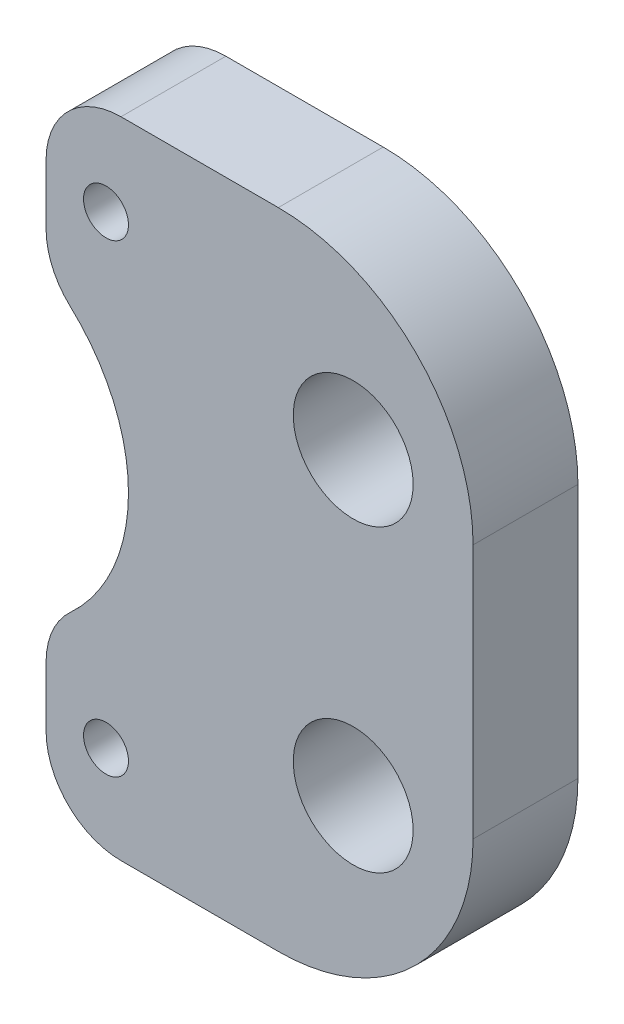
ISO-10303-21;
HEADER;
FILE_DESCRIPTION(('STEP AP214'),'2;1');
FILE_NAME('part.step','',(''),(''),'','','');
FILE_SCHEMA(('AUTOMOTIVE_DESIGN { 1 0 10303 214 1 1 1 1 }'));
ENDSEC;
DATA;
#1=APPLICATION_CONTEXT('core data for automotive mechanical design processes');
#2=APPLICATION_PROTOCOL_DEFINITION('international standard','automotive_design',2000,#1);
#3=PRODUCT_CONTEXT('',#1,'mechanical');
#4=PRODUCT('Part','Part','',(#3));
#5=PRODUCT_RELATED_PRODUCT_CATEGORY('part','',(#4));
#6=PRODUCT_DEFINITION_FORMATION('','',#4);
#7=PRODUCT_DEFINITION_CONTEXT('part definition',#1,'design');
#8=PRODUCT_DEFINITION('design','',#6,#7);
#9=PRODUCT_DEFINITION_SHAPE('','',#8);
#10=(LENGTH_UNIT() NAMED_UNIT(*) SI_UNIT(.MILLI.,.METRE.));
#11=(NAMED_UNIT(*) PLANE_ANGLE_UNIT() SI_UNIT($,.RADIAN.));
#12=(NAMED_UNIT(*) SI_UNIT($,.STERADIAN.) SOLID_ANGLE_UNIT());
#13=UNCERTAINTY_MEASURE_WITH_UNIT(LENGTH_MEASURE(1.E-05),#10,'distance_accuracy_value','');
#14=(GEOMETRIC_REPRESENTATION_CONTEXT(3) GLOBAL_UNCERTAINTY_ASSIGNED_CONTEXT((#13)) GLOBAL_UNIT_ASSIGNED_CONTEXT((#10,
#11,#12)) REPRESENTATION_CONTEXT('',''));
#15=CARTESIAN_POINT('',(0.,0.,0.));
#16=DIRECTION('',(0.,0.,1.));
#17=DIRECTION('',(1.,0.,0.));
#18=AXIS2_PLACEMENT_3D('',#15,#16,#17);
#19=CARTESIAN_POINT('',(5.,34.0199840255489,7.));
#20=DIRECTION('',(0.,0.,-1.));
#21=DIRECTION('',(-1.,0.,0.));
#22=AXIS2_PLACEMENT_3D('',#19,#20,#21);
#23=PLANE('',#22);
#24=CARTESIAN_POINT('',(4.,37.,7.));
#25=DIRECTION('',(0.,0.,1.));
#26=DIRECTION('',(1.,0.,0.));
#27=AXIS2_PLACEMENT_3D('',#24,#25,#26);
#28=CIRCLE('',#27,1.5);
#29=CARTESIAN_POINT('',(5.5,37.,7.));
#30=VERTEX_POINT('',#29);
#31=EDGE_CURVE('E292',#30,#30,#28,.T.);
#32=ORIENTED_EDGE('',*,*,#31,.F.);
#33=EDGE_LOOP('',(#32));
#34=FACE_BOUND('',#33,.T.);
#35=CARTESIAN_POINT('',(20.5,31.5,7.));
#36=DIRECTION('',(0.,0.,1.));
#37=DIRECTION('',(1.,0.,0.));
#38=AXIS2_PLACEMENT_3D('',#35,#36,#37);
#39=CIRCLE('',#38,4.00000000000002);
#40=CARTESIAN_POINT('',(24.5,31.5,7.));
#41=VERTEX_POINT('',#40);
#42=EDGE_CURVE('E158',#41,#41,#39,.T.);
#43=ORIENTED_EDGE('',*,*,#42,.F.);
#44=EDGE_LOOP('',(#43));
#45=FACE_BOUND('',#44,.T.);
#46=CARTESIAN_POINT('',(5.,34.0199840255489,7.));
#47=DIRECTION('',(0.,0.,1.));
#48=DIRECTION('',(-1.,0.,0.));
#49=AXIS2_PLACEMENT_3D('',#46,#47,#48);
#50=CIRCLE('',#49,5.);
#51=CARTESIAN_POINT('',(0.,34.0199840255489,7.));
#52=VERTEX_POINT('',#51);
#53=CARTESIAN_POINT('',(1.61764705882352,30.3376357827404,7.));
#54=VERTEX_POINT('',#53);
#55=EDGE_CURVE('E177',#52,#54,#50,.T.);
#56=ORIENTED_EDGE('',*,*,#55,.T.);
#57=CARTESIAN_POINT('',(-6.50000000000001,21.5,7.));
#58=DIRECTION('',(0.,0.,-1.));
#59=DIRECTION('',(1.,0.,0.));
#60=AXIS2_PLACEMENT_3D('',#57,#58,#59);
#61=CIRCLE('',#60,12.);
#62=CARTESIAN_POINT('',(1.61764705882352,12.6623642172596,7.));
#63=VERTEX_POINT('',#62);
#64=EDGE_CURVE('E105',#54,#63,#61,.T.);
#65=ORIENTED_EDGE('',*,*,#64,.T.);
#66=CARTESIAN_POINT('',(5.,8.9800159744511,7.));
#67=DIRECTION('',(0.,0.,1.));
#68=DIRECTION('',(-1.,0.,0.));
#69=AXIS2_PLACEMENT_3D('',#66,#67,#68);
#70=CIRCLE('',#69,5.);
#71=CARTESIAN_POINT('',(0.,8.9800159744511,7.));
#72=VERTEX_POINT('',#71);
#73=EDGE_CURVE('E204',#63,#72,#70,.T.);
#74=ORIENTED_EDGE('',*,*,#73,.T.);
#75=DIRECTION('',(0.,-1.,0.));
#76=VECTOR('',#75,1.);
#77=CARTESIAN_POINT('',(0.,5.00000000000004,7.));
#78=LINE('',#77,#76);
#79=CARTESIAN_POINT('',(0.,5.00000000000004,7.));
#80=VERTEX_POINT('',#79);
#81=EDGE_CURVE('E223',#72,#80,#78,.T.);
#82=ORIENTED_EDGE('',*,*,#81,.T.);
#83=CARTESIAN_POINT('',(5.,5.,7.));
#84=DIRECTION('',(0.,0.,1.));
#85=DIRECTION('',(1.,0.,0.));
#86=AXIS2_PLACEMENT_3D('',#83,#84,#85);
#87=CIRCLE('',#86,5.);
#88=CARTESIAN_POINT('',(5.00000000000003,0.,7.));
#89=VERTEX_POINT('',#88);
#90=EDGE_CURVE('E220',#80,#89,#87,.T.);
#91=ORIENTED_EDGE('',*,*,#90,.T.);
#92=DIRECTION('',(1.,0.,0.));
#93=VECTOR('',#92,1.);
#94=CARTESIAN_POINT('',(5.00000000000004,0.,7.));
#95=LINE('',#94,#93);
#96=CARTESIAN_POINT('',(15.5,0.,7.));
#97=VERTEX_POINT('',#96);
#98=EDGE_CURVE('E222',#89,#97,#95,.T.);
#99=ORIENTED_EDGE('',*,*,#98,.T.);
#100=CARTESIAN_POINT('',(15.5,13.,7.));
#101=DIRECTION('',(0.,0.,1.));
#102=DIRECTION('',(-1.,0.,0.));
#103=AXIS2_PLACEMENT_3D('',#100,#101,#102);
#104=CIRCLE('',#103,13.);
#105=CARTESIAN_POINT('',(28.5,13.,7.));
#106=VERTEX_POINT('',#105);
#107=EDGE_CURVE('E225',#97,#106,#104,.T.);
#108=ORIENTED_EDGE('',*,*,#107,.T.);
#109=DIRECTION('',(0.,1.,0.));
#110=VECTOR('',#109,1.);
#111=CARTESIAN_POINT('',(28.5,13.,7.));
#112=LINE('',#111,#110);
#113=CARTESIAN_POINT('',(28.5,30.,7.));
#114=VERTEX_POINT('',#113);
#115=EDGE_CURVE('E231',#106,#114,#112,.T.);
#116=ORIENTED_EDGE('',*,*,#115,.T.);
#117=CARTESIAN_POINT('',(15.5,30.,7.));
#118=DIRECTION('',(0.,0.,1.));
#119=DIRECTION('',(1.,0.,0.));
#120=AXIS2_PLACEMENT_3D('',#117,#118,#119);
#121=CIRCLE('',#120,13.);
#122=CARTESIAN_POINT('',(15.5,43.,7.));
#123=VERTEX_POINT('',#122);
#124=EDGE_CURVE('E136',#114,#123,#121,.T.);
#125=ORIENTED_EDGE('',*,*,#124,.T.);
#126=DIRECTION('',(-1.,0.,0.));
#127=VECTOR('',#126,1.);
#128=CARTESIAN_POINT('',(15.5,43.,7.));
#129=LINE('',#128,#127);
#130=CARTESIAN_POINT('',(5.00000000000004,43.,7.));
#131=VERTEX_POINT('',#130);
#132=EDGE_CURVE('E130',#123,#131,#129,.T.);
#133=ORIENTED_EDGE('',*,*,#132,.T.);
#134=CARTESIAN_POINT('',(5.,38.,7.));
#135=DIRECTION('',(0.,0.,1.));
#136=DIRECTION('',(1.,0.,0.));
#137=AXIS2_PLACEMENT_3D('',#134,#135,#136);
#138=CIRCLE('',#137,5.);
#139=CARTESIAN_POINT('',(0.,38.,7.));
#140=VERTEX_POINT('',#139);
#141=EDGE_CURVE('E134',#131,#140,#138,.T.);
#142=ORIENTED_EDGE('',*,*,#141,.T.);
#143=DIRECTION('',(0.,-1.,0.));
#144=VECTOR('',#143,1.);
#145=CARTESIAN_POINT('',(0.,34.0199840255489,7.));
#146=LINE('',#145,#144);
#147=EDGE_CURVE('E50',#140,#52,#146,.T.);
#148=ORIENTED_EDGE('',*,*,#147,.T.);
#149=EDGE_LOOP('',(#56,#65,#74,#82,#91,#99,#108,#116,#125,#133,#142,#148));
#150=FACE_BOUND('',#149,.T.);
#151=CARTESIAN_POINT('',(20.5,11.5,7.));
#152=DIRECTION('',(0.,0.,1.));
#153=DIRECTION('',(1.,0.,0.));
#154=AXIS2_PLACEMENT_3D('',#151,#152,#153);
#155=CIRCLE('',#154,4.00000000000001);
#156=CARTESIAN_POINT('',(24.5,11.5,7.));
#157=VERTEX_POINT('',#156);
#158=EDGE_CURVE('E298',#157,#157,#155,.T.);
#159=ORIENTED_EDGE('',*,*,#158,.F.);
#160=EDGE_LOOP('',(#159));
#161=FACE_BOUND('',#160,.T.);
#162=CARTESIAN_POINT('',(4.,6.,7.));
#163=DIRECTION('',(0.,0.,1.));
#164=DIRECTION('',(1.,0.,0.));
#165=AXIS2_PLACEMENT_3D('',#162,#163,#164);
#166=CIRCLE('',#165,1.5);
#167=CARTESIAN_POINT('',(5.5,6.,7.));
#168=VERTEX_POINT('',#167);
#169=EDGE_CURVE('E283',#168,#168,#166,.T.);
#170=ORIENTED_EDGE('',*,*,#169,.F.);
#171=EDGE_LOOP('',(#170));
#172=FACE_BOUND('',#171,.T.);
#173=ADVANCED_FACE('F33',(#34,#45,#150,#161,#172),#23,.F.);
#174=CARTESIAN_POINT('',(5.,34.0199840255489,0.));
#175=DIRECTION('',(0.,0.,-1.));
#176=DIRECTION('',(-1.,0.,0.));
#177=AXIS2_PLACEMENT_3D('',#174,#175,#176);
#178=PLANE('',#177);
#179=CARTESIAN_POINT('',(4.,37.,0.));
#180=DIRECTION('',(0.,0.,1.));
#181=DIRECTION('',(1.,0.,0.));
#182=AXIS2_PLACEMENT_3D('',#179,#180,#181);
#183=CIRCLE('',#182,1.5);
#184=CARTESIAN_POINT('',(5.5,37.,0.));
#185=VERTEX_POINT('',#184);
#186=EDGE_CURVE('E289',#185,#185,#183,.T.);
#187=ORIENTED_EDGE('',*,*,#186,.T.);
#188=EDGE_LOOP('',(#187));
#189=FACE_BOUND('',#188,.T.);
#190=CARTESIAN_POINT('',(20.5,31.5,0.));
#191=DIRECTION('',(0.,0.,1.));
#192=DIRECTION('',(1.,0.,0.));
#193=AXIS2_PLACEMENT_3D('',#190,#191,#192);
#194=CIRCLE('',#193,4.00000000000002);
#195=CARTESIAN_POINT('',(24.5,31.5,0.));
#196=VERTEX_POINT('',#195);
#197=EDGE_CURVE('E301',#196,#196,#194,.T.);
#198=ORIENTED_EDGE('',*,*,#197,.T.);
#199=EDGE_LOOP('',(#198));
#200=FACE_BOUND('',#199,.T.);
#201=CARTESIAN_POINT('',(5.,34.0199840255489,0.));
#202=DIRECTION('',(0.,0.,1.));
#203=DIRECTION('',(-1.,0.,0.));
#204=AXIS2_PLACEMENT_3D('',#201,#202,#203);
#205=CIRCLE('',#204,5.);
#206=CARTESIAN_POINT('',(0.,34.0199840255489,0.));
#207=VERTEX_POINT('',#206);
#208=CARTESIAN_POINT('',(1.61764705882352,30.3376357827404,0.));
#209=VERTEX_POINT('',#208);
#210=EDGE_CURVE('E154',#207,#209,#205,.T.);
#211=ORIENTED_EDGE('',*,*,#210,.F.);
#212=DIRECTION('',(0.,-1.,0.));
#213=VECTOR('',#212,1.);
#214=CARTESIAN_POINT('',(0.,34.0199840255489,0.));
#215=LINE('',#214,#213);
#216=CARTESIAN_POINT('',(0.,38.,0.));
#217=VERTEX_POINT('',#216);
#218=EDGE_CURVE('E97',#217,#207,#215,.T.);
#219=ORIENTED_EDGE('',*,*,#218,.F.);
#220=CARTESIAN_POINT('',(5.,38.,0.));
#221=DIRECTION('',(0.,0.,1.));
#222=DIRECTION('',(1.,0.,0.));
#223=AXIS2_PLACEMENT_3D('',#220,#221,#222);
#224=CIRCLE('',#223,5.);
#225=CARTESIAN_POINT('',(5.00000000000004,43.,0.));
#226=VERTEX_POINT('',#225);
#227=EDGE_CURVE('E91',#226,#217,#224,.T.);
#228=ORIENTED_EDGE('',*,*,#227,.F.);
#229=DIRECTION('',(-1.,0.,0.));
#230=VECTOR('',#229,1.);
#231=CARTESIAN_POINT('',(15.5,43.,0.));
#232=LINE('',#231,#230);
#233=CARTESIAN_POINT('',(15.5,43.,0.));
#234=VERTEX_POINT('',#233);
#235=EDGE_CURVE('E144',#234,#226,#232,.T.);
#236=ORIENTED_EDGE('',*,*,#235,.F.);
#237=CARTESIAN_POINT('',(15.5,30.,0.));
#238=DIRECTION('',(0.,0.,1.));
#239=DIRECTION('',(1.,0.,0.));
#240=AXIS2_PLACEMENT_3D('',#237,#238,#239);
#241=CIRCLE('',#240,13.);
#242=CARTESIAN_POINT('',(28.5,30.,0.));
#243=VERTEX_POINT('',#242);
#244=EDGE_CURVE('E172',#243,#234,#241,.T.);
#245=ORIENTED_EDGE('',*,*,#244,.F.);
#246=DIRECTION('',(0.,1.,0.));
#247=VECTOR('',#246,1.);
#248=CARTESIAN_POINT('',(28.5,13.,0.));
#249=LINE('',#248,#247);
#250=CARTESIAN_POINT('',(28.5,13.,0.));
#251=VERTEX_POINT('',#250);
#252=EDGE_CURVE('E170',#251,#243,#249,.T.);
#253=ORIENTED_EDGE('',*,*,#252,.F.);
#254=CARTESIAN_POINT('',(15.5,13.,0.));
#255=DIRECTION('',(0.,0.,1.));
#256=DIRECTION('',(-1.,0.,0.));
#257=AXIS2_PLACEMENT_3D('',#254,#255,#256);
#258=CIRCLE('',#257,13.);
#259=CARTESIAN_POINT('',(15.5,0.,0.));
#260=VERTEX_POINT('',#259);
#261=EDGE_CURVE('E168',#260,#251,#258,.T.);
#262=ORIENTED_EDGE('',*,*,#261,.F.);
#263=DIRECTION('',(1.,0.,0.));
#264=VECTOR('',#263,1.);
#265=CARTESIAN_POINT('',(5.00000000000004,0.,0.));
#266=LINE('',#265,#264);
#267=CARTESIAN_POINT('',(5.00000000000003,0.,0.));
#268=VERTEX_POINT('',#267);
#269=EDGE_CURVE('E166',#268,#260,#266,.T.);
#270=ORIENTED_EDGE('',*,*,#269,.F.);
#271=CARTESIAN_POINT('',(5.,5.,0.));
#272=DIRECTION('',(0.,0.,1.));
#273=DIRECTION('',(1.,0.,0.));
#274=AXIS2_PLACEMENT_3D('',#271,#272,#273);
#275=CIRCLE('',#274,5.);
#276=CARTESIAN_POINT('',(0.,5.00000000000004,0.));
#277=VERTEX_POINT('',#276);
#278=EDGE_CURVE('E164',#277,#268,#275,.T.);
#279=ORIENTED_EDGE('',*,*,#278,.F.);
#280=DIRECTION('',(0.,-1.,0.));
#281=VECTOR('',#280,1.);
#282=CARTESIAN_POINT('',(0.,5.00000000000004,0.));
#283=LINE('',#282,#281);
#284=CARTESIAN_POINT('',(0.,8.9800159744511,0.));
#285=VERTEX_POINT('',#284);
#286=EDGE_CURVE('E162',#285,#277,#283,.T.);
#287=ORIENTED_EDGE('',*,*,#286,.F.);
#288=CARTESIAN_POINT('',(5.,8.9800159744511,0.));
#289=DIRECTION('',(0.,0.,1.));
#290=DIRECTION('',(-1.,0.,0.));
#291=AXIS2_PLACEMENT_3D('',#288,#289,#290);
#292=CIRCLE('',#291,5.);
#293=CARTESIAN_POINT('',(1.61764705882352,12.6623642172596,0.));
#294=VERTEX_POINT('',#293);
#295=EDGE_CURVE('E160',#294,#285,#292,.T.);
#296=ORIENTED_EDGE('',*,*,#295,.F.);
#297=CARTESIAN_POINT('',(-6.50000000000001,21.5,0.));
#298=DIRECTION('',(0.,0.,-1.));
#299=DIRECTION('',(1.,0.,0.));
#300=AXIS2_PLACEMENT_3D('',#297,#298,#299);
#301=CIRCLE('',#300,12.);
#302=EDGE_CURVE('E157',#209,#294,#301,.T.);
#303=ORIENTED_EDGE('',*,*,#302,.F.);
#304=EDGE_LOOP('',(#211,#219,#228,#236,#245,#253,#262,#270,#279,#287,#296,#303));
#305=FACE_BOUND('',#304,.T.);
#306=CARTESIAN_POINT('',(20.5,11.5,0.));
#307=DIRECTION('',(0.,0.,1.));
#308=DIRECTION('',(1.,0.,0.));
#309=AXIS2_PLACEMENT_3D('',#306,#307,#308);
#310=CIRCLE('',#309,4.00000000000001);
#311=CARTESIAN_POINT('',(24.5,11.5,0.));
#312=VERTEX_POINT('',#311);
#313=EDGE_CURVE('E295',#312,#312,#310,.T.);
#314=ORIENTED_EDGE('',*,*,#313,.T.);
#315=EDGE_LOOP('',(#314));
#316=FACE_BOUND('',#315,.T.);
#317=CARTESIAN_POINT('',(4.,6.,0.));
#318=DIRECTION('',(0.,0.,1.));
#319=DIRECTION('',(1.,0.,0.));
#320=AXIS2_PLACEMENT_3D('',#317,#318,#319);
#321=CIRCLE('',#320,1.5);
#322=CARTESIAN_POINT('',(5.5,6.,0.));
#323=VERTEX_POINT('',#322);
#324=EDGE_CURVE('E286',#323,#323,#321,.T.);
#325=ORIENTED_EDGE('',*,*,#324,.T.);
#326=EDGE_LOOP('',(#325));
#327=FACE_BOUND('',#326,.T.);
#328=ADVANCED_FACE('F208',(#189,#200,#305,#316,#327),#178,.T.);
#329=CARTESIAN_POINT('',(5.,34.0199840255489,7.));
#330=DIRECTION('',(0.,0.,-1.));
#331=DIRECTION('',(-1.,0.,0.));
#332=AXIS2_PLACEMENT_3D('',#329,#330,#331);
#333=CYLINDRICAL_SURFACE('',#332,5.);
#334=ORIENTED_EDGE('',*,*,#210,.T.);
#335=DIRECTION('',(0.,0.,-1.));
#336=VECTOR('',#335,1.);
#337=CARTESIAN_POINT('',(1.61764705882352,30.3376357827404,7.));
#338=LINE('',#337,#336);
#339=EDGE_CURVE('E11',#54,#209,#338,.T.);
#340=ORIENTED_EDGE('',*,*,#339,.F.);
#341=ORIENTED_EDGE('',*,*,#55,.F.);
#342=DIRECTION('',(0.,0.,-1.));
#343=VECTOR('',#342,1.);
#344=CARTESIAN_POINT('',(0.,34.0199840255489,7.));
#345=LINE('',#344,#343);
#346=EDGE_CURVE('E150',#52,#207,#345,.T.);
#347=ORIENTED_EDGE('',*,*,#346,.T.);
#348=EDGE_LOOP('',(#334,#340,#341,#347));
#349=FACE_BOUND('',#348,.T.);
#350=ADVANCED_FACE('F35',(#349),#333,.T.);
#351=CARTESIAN_POINT('',(-6.50000000000001,21.5,7.));
#352=DIRECTION('',(0.,0.,-1.));
#353=DIRECTION('',(-1.,0.,0.));
#354=AXIS2_PLACEMENT_3D('',#351,#352,#353);
#355=CYLINDRICAL_SURFACE('',#354,12.);
#356=ORIENTED_EDGE('',*,*,#302,.T.);
#357=DIRECTION('',(0.,0.,-1.));
#358=VECTOR('',#357,1.);
#359=CARTESIAN_POINT('',(1.61764705882352,12.6623642172596,7.));
#360=LINE('',#359,#358);
#361=EDGE_CURVE('E42',#63,#294,#360,.T.);
#362=ORIENTED_EDGE('',*,*,#361,.F.);
#363=ORIENTED_EDGE('',*,*,#64,.F.);
#364=ORIENTED_EDGE('',*,*,#339,.T.);
#365=EDGE_LOOP('',(#356,#362,#363,#364));
#366=FACE_BOUND('',#365,.T.);
#367=ADVANCED_FACE('F410',(#366),#355,.F.);
#368=CARTESIAN_POINT('',(5.,8.9800159744511,7.));
#369=DIRECTION('',(0.,0.,-1.));
#370=DIRECTION('',(-1.,0.,0.));
#371=AXIS2_PLACEMENT_3D('',#368,#369,#370);
#372=CYLINDRICAL_SURFACE('',#371,5.);
#373=ORIENTED_EDGE('',*,*,#295,.T.);
#374=DIRECTION('',(0.,0.,-1.));
#375=VECTOR('',#374,1.);
#376=CARTESIAN_POINT('',(0.,8.9800159744511,7.));
#377=LINE('',#376,#375);
#378=EDGE_CURVE('E196',#72,#285,#377,.T.);
#379=ORIENTED_EDGE('',*,*,#378,.F.);
#380=ORIENTED_EDGE('',*,*,#73,.F.);
#381=ORIENTED_EDGE('',*,*,#361,.T.);
#382=EDGE_LOOP('',(#373,#379,#380,#381));
#383=FACE_BOUND('',#382,.T.);
#384=ADVANCED_FACE('F202',(#383),#372,.T.);
#385=CARTESIAN_POINT('',(0.,5.00000000000004,7.));
#386=DIRECTION('',(1.,0.,0.));
#387=DIRECTION('',(0.,0.,-1.));
#388=AXIS2_PLACEMENT_3D('',#385,#386,#387);
#389=PLANE('',#388);
#390=ORIENTED_EDGE('',*,*,#286,.T.);
#391=DIRECTION('',(0.,0.,-1.));
#392=VECTOR('',#391,1.);
#393=CARTESIAN_POINT('',(0.,5.00000000000004,7.));
#394=LINE('',#393,#392);
#395=EDGE_CURVE('E193',#80,#277,#394,.T.);
#396=ORIENTED_EDGE('',*,*,#395,.F.);
#397=ORIENTED_EDGE('',*,*,#81,.F.);
#398=ORIENTED_EDGE('',*,*,#378,.T.);
#399=EDGE_LOOP('',(#390,#396,#397,#398));
#400=FACE_BOUND('',#399,.T.);
#401=ADVANCED_FACE('F214',(#400),#389,.F.);
#402=CARTESIAN_POINT('',(5.,5.,7.));
#403=DIRECTION('',(0.,0.,-1.));
#404=DIRECTION('',(-1.,0.,0.));
#405=AXIS2_PLACEMENT_3D('',#402,#403,#404);
#406=CYLINDRICAL_SURFACE('',#405,5.);
#407=ORIENTED_EDGE('',*,*,#278,.T.);
#408=DIRECTION('',(0.,0.,-1.));
#409=VECTOR('',#408,1.);
#410=CARTESIAN_POINT('',(5.00000000000003,0.,7.));
#411=LINE('',#410,#409);
#412=EDGE_CURVE('E190',#89,#268,#411,.T.);
#413=ORIENTED_EDGE('',*,*,#412,.F.);
#414=ORIENTED_EDGE('',*,*,#90,.F.);
#415=ORIENTED_EDGE('',*,*,#395,.T.);
#416=EDGE_LOOP('',(#407,#413,#414,#415));
#417=FACE_BOUND('',#416,.T.);
#418=ADVANCED_FACE('F218',(#417),#406,.T.);
#419=CARTESIAN_POINT('',(5.00000000000004,0.,7.));
#420=DIRECTION('',(0.,1.,0.));
#421=DIRECTION('',(0.,0.,1.));
#422=AXIS2_PLACEMENT_3D('',#419,#420,#421);
#423=PLANE('',#422);
#424=ORIENTED_EDGE('',*,*,#269,.T.);
#425=DIRECTION('',(0.,0.,-1.));
#426=VECTOR('',#425,1.);
#427=CARTESIAN_POINT('',(15.5,0.,7.));
#428=LINE('',#427,#426);
#429=EDGE_CURVE('E187',#97,#260,#428,.T.);
#430=ORIENTED_EDGE('',*,*,#429,.F.);
#431=ORIENTED_EDGE('',*,*,#98,.F.);
#432=ORIENTED_EDGE('',*,*,#412,.T.);
#433=EDGE_LOOP('',(#424,#430,#431,#432));
#434=FACE_BOUND('',#433,.T.);
#435=ADVANCED_FACE('F375',(#434),#423,.F.);
#436=CARTESIAN_POINT('',(15.5,13.,7.));
#437=DIRECTION('',(0.,0.,-1.));
#438=DIRECTION('',(-1.,0.,0.));
#439=AXIS2_PLACEMENT_3D('',#436,#437,#438);
#440=CYLINDRICAL_SURFACE('',#439,13.);
#441=ORIENTED_EDGE('',*,*,#261,.T.);
#442=DIRECTION('',(0.,0.,-1.));
#443=VECTOR('',#442,1.);
#444=CARTESIAN_POINT('',(28.5,13.,7.));
#445=LINE('',#444,#443);
#446=EDGE_CURVE('E184',#106,#251,#445,.T.);
#447=ORIENTED_EDGE('',*,*,#446,.F.);
#448=ORIENTED_EDGE('',*,*,#107,.F.);
#449=ORIENTED_EDGE('',*,*,#429,.T.);
#450=EDGE_LOOP('',(#441,#447,#448,#449));
#451=FACE_BOUND('',#450,.T.);
#452=ADVANCED_FACE('F366',(#451),#440,.T.);
#453=CARTESIAN_POINT('',(28.5,13.,7.));
#454=DIRECTION('',(-1.,0.,0.));
#455=DIRECTION('',(0.,0.,1.));
#456=AXIS2_PLACEMENT_3D('',#453,#454,#455);
#457=PLANE('',#456);
#458=ORIENTED_EDGE('',*,*,#252,.T.);
#459=DIRECTION('',(0.,0.,-1.));
#460=VECTOR('',#459,1.);
#461=CARTESIAN_POINT('',(28.5,30.,7.));
#462=LINE('',#461,#460);
#463=EDGE_CURVE('E181',#114,#243,#462,.T.);
#464=ORIENTED_EDGE('',*,*,#463,.F.);
#465=ORIENTED_EDGE('',*,*,#115,.F.);
#466=ORIENTED_EDGE('',*,*,#446,.T.);
#467=EDGE_LOOP('',(#458,#464,#465,#466));
#468=FACE_BOUND('',#467,.T.);
#469=ADVANCED_FACE('F237',(#468),#457,.F.);
#470=CARTESIAN_POINT('',(15.5,30.,7.));
#471=DIRECTION('',(0.,0.,-1.));
#472=DIRECTION('',(-1.,0.,0.));
#473=AXIS2_PLACEMENT_3D('',#470,#471,#472);
#474=CYLINDRICAL_SURFACE('',#473,13.);
#475=ORIENTED_EDGE('',*,*,#244,.T.);
#476=DIRECTION('',(0.,0.,-1.));
#477=VECTOR('',#476,1.);
#478=CARTESIAN_POINT('',(15.5,43.,7.));
#479=LINE('',#478,#477);
#480=EDGE_CURVE('E145',#123,#234,#479,.T.);
#481=ORIENTED_EDGE('',*,*,#480,.F.);
#482=ORIENTED_EDGE('',*,*,#124,.F.);
#483=ORIENTED_EDGE('',*,*,#463,.T.);
#484=EDGE_LOOP('',(#475,#481,#482,#483));
#485=FACE_BOUND('',#484,.T.);
#486=ADVANCED_FACE('F241',(#485),#474,.T.);
#487=CARTESIAN_POINT('',(15.5,43.,7.));
#488=DIRECTION('',(0.,-1.,0.));
#489=DIRECTION('',(0.,0.,-1.));
#490=AXIS2_PLACEMENT_3D('',#487,#488,#489);
#491=PLANE('',#490);
#492=ORIENTED_EDGE('',*,*,#235,.T.);
#493=DIRECTION('',(0.,0.,-1.));
#494=VECTOR('',#493,1.);
#495=CARTESIAN_POINT('',(5.00000000000004,43.,7.));
#496=LINE('',#495,#494);
#497=EDGE_CURVE('E141',#131,#226,#496,.T.);
#498=ORIENTED_EDGE('',*,*,#497,.F.);
#499=ORIENTED_EDGE('',*,*,#132,.F.);
#500=ORIENTED_EDGE('',*,*,#480,.T.);
#501=EDGE_LOOP('',(#492,#498,#499,#500));
#502=FACE_BOUND('',#501,.T.);
#503=ADVANCED_FACE('F142',(#502),#491,.F.);
#504=CARTESIAN_POINT('',(5.,38.,7.));
#505=DIRECTION('',(0.,0.,-1.));
#506=DIRECTION('',(-1.,0.,0.));
#507=AXIS2_PLACEMENT_3D('',#504,#505,#506);
#508=CYLINDRICAL_SURFACE('',#507,5.);
#509=ORIENTED_EDGE('',*,*,#227,.T.);
#510=DIRECTION('',(0.,0.,-1.));
#511=VECTOR('',#510,1.);
#512=CARTESIAN_POINT('',(0.,38.,7.));
#513=LINE('',#512,#511);
#514=EDGE_CURVE('E146',#140,#217,#513,.T.);
#515=ORIENTED_EDGE('',*,*,#514,.F.);
#516=ORIENTED_EDGE('',*,*,#141,.F.);
#517=ORIENTED_EDGE('',*,*,#497,.T.);
#518=EDGE_LOOP('',(#509,#515,#516,#517));
#519=FACE_BOUND('',#518,.T.);
#520=ADVANCED_FACE('F148',(#519),#508,.T.);
#521=CARTESIAN_POINT('',(0.,34.0199840255489,7.));
#522=DIRECTION('',(1.,0.,0.));
#523=DIRECTION('',(0.,0.,-1.));
#524=AXIS2_PLACEMENT_3D('',#521,#522,#523);
#525=PLANE('',#524);
#526=ORIENTED_EDGE('',*,*,#218,.T.);
#527=ORIENTED_EDGE('',*,*,#346,.F.);
#528=ORIENTED_EDGE('',*,*,#147,.F.);
#529=ORIENTED_EDGE('',*,*,#514,.T.);
#530=EDGE_LOOP('',(#526,#527,#528,#529));
#531=FACE_BOUND('',#530,.T.);
#532=ADVANCED_FACE('F245',(#531),#525,.F.);
#533=CARTESIAN_POINT('',(20.5,31.5,7.));
#534=DIRECTION('',(0.,0.,-1.));
#535=DIRECTION('',(-1.,0.,0.));
#536=AXIS2_PLACEMENT_3D('',#533,#534,#535);
#537=CYLINDRICAL_SURFACE('',#536,4.00000000000002);
#538=ORIENTED_EDGE('',*,*,#42,.T.);
#539=EDGE_LOOP('',(#538));
#540=FACE_BOUND('',#539,.T.);
#541=ORIENTED_EDGE('',*,*,#197,.F.);
#542=EDGE_LOOP('',(#541));
#543=FACE_BOUND('',#542,.T.);
#544=ADVANCED_FACE('F247',(#540,#543),#537,.F.);
#545=CARTESIAN_POINT('',(20.5,11.5,7.));
#546=DIRECTION('',(0.,0.,-1.));
#547=DIRECTION('',(-1.,0.,0.));
#548=AXIS2_PLACEMENT_3D('',#545,#546,#547);
#549=CYLINDRICAL_SURFACE('',#548,4.00000000000001);
#550=ORIENTED_EDGE('',*,*,#158,.T.);
#551=EDGE_LOOP('',(#550));
#552=FACE_BOUND('',#551,.T.);
#553=ORIENTED_EDGE('',*,*,#313,.F.);
#554=EDGE_LOOP('',(#553));
#555=FACE_BOUND('',#554,.T.);
#556=ADVANCED_FACE('F253',(#552,#555),#549,.F.);
#557=CARTESIAN_POINT('',(4.,37.,7.));
#558=DIRECTION('',(0.,0.,-1.));
#559=DIRECTION('',(-1.,0.,0.));
#560=AXIS2_PLACEMENT_3D('',#557,#558,#559);
#561=CYLINDRICAL_SURFACE('',#560,1.5);
#562=ORIENTED_EDGE('',*,*,#31,.T.);
#563=EDGE_LOOP('',(#562));
#564=FACE_BOUND('',#563,.T.);
#565=ORIENTED_EDGE('',*,*,#186,.F.);
#566=EDGE_LOOP('',(#565));
#567=FACE_BOUND('',#566,.T.);
#568=ADVANCED_FACE('F270',(#564,#567),#561,.F.);
#569=CARTESIAN_POINT('',(4.,6.,7.));
#570=DIRECTION('',(0.,0.,-1.));
#571=DIRECTION('',(-1.,0.,0.));
#572=AXIS2_PLACEMENT_3D('',#569,#570,#571);
#573=CYLINDRICAL_SURFACE('',#572,1.5);
#574=ORIENTED_EDGE('',*,*,#169,.T.);
#575=EDGE_LOOP('',(#574));
#576=FACE_BOUND('',#575,.T.);
#577=ORIENTED_EDGE('',*,*,#324,.F.);
#578=EDGE_LOOP('',(#577));
#579=FACE_BOUND('',#578,.T.);
#580=ADVANCED_FACE('F274',(#576,#579),#573,.F.);
#581=CLOSED_SHELL('',(#173,#328,#350,#367,#384,#401,#418,#435,#452,#469,#486,#503,#520,#532,
#544,#556,#568,#580));
#582=MANIFOLD_SOLID_BREP('B2',#581);
#583=ADVANCED_BREP_SHAPE_REPRESENTATION('',(#18,#582),#14);
#584=SHAPE_DEFINITION_REPRESENTATION(#9,#583);
ENDSEC;
END-ISO-10303-21;
